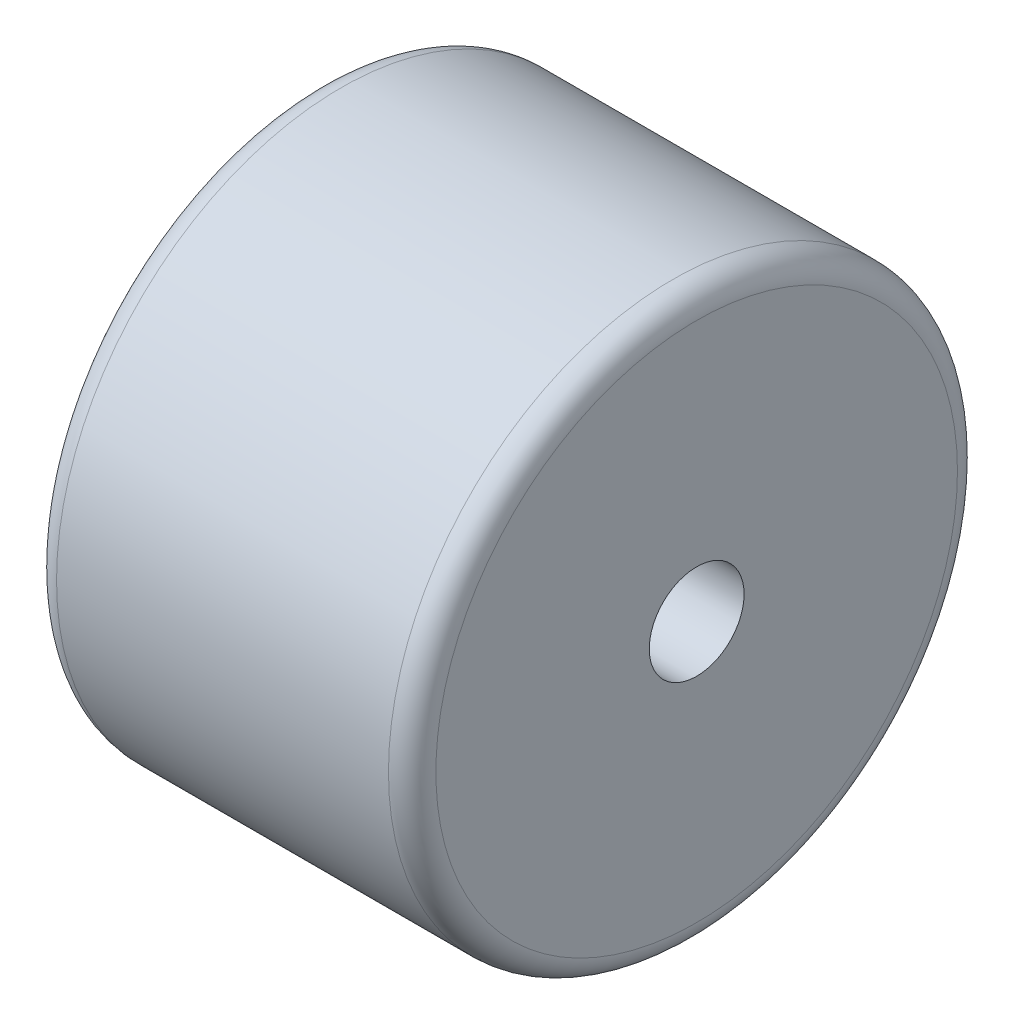
ISO-10303-21;
HEADER;
FILE_DESCRIPTION(('STEP AP214'),'2;1');
FILE_NAME('part.step','',(''),(''),'','','');
FILE_SCHEMA(('AUTOMOTIVE_DESIGN { 1 0 10303 214 1 1 1 1 }'));
ENDSEC;
DATA;
#1=APPLICATION_CONTEXT('core data for automotive mechanical design processes');
#2=APPLICATION_PROTOCOL_DEFINITION('international standard','automotive_design',2000,#1);
#3=PRODUCT_CONTEXT('',#1,'mechanical');
#4=PRODUCT('Part','Part','',(#3));
#5=PRODUCT_RELATED_PRODUCT_CATEGORY('part','',(#4));
#6=PRODUCT_DEFINITION_FORMATION('','',#4);
#7=PRODUCT_DEFINITION_CONTEXT('part definition',#1,'design');
#8=PRODUCT_DEFINITION('design','',#6,#7);
#9=PRODUCT_DEFINITION_SHAPE('','',#8);
#10=(LENGTH_UNIT() NAMED_UNIT(*) SI_UNIT(.MILLI.,.METRE.));
#11=(NAMED_UNIT(*) PLANE_ANGLE_UNIT() SI_UNIT($,.RADIAN.));
#12=(NAMED_UNIT(*) SI_UNIT($,.STERADIAN.) SOLID_ANGLE_UNIT());
#13=UNCERTAINTY_MEASURE_WITH_UNIT(LENGTH_MEASURE(1.E-05),#10,'distance_accuracy_value','');
#14=(GEOMETRIC_REPRESENTATION_CONTEXT(3) GLOBAL_UNCERTAINTY_ASSIGNED_CONTEXT((#13)) GLOBAL_UNIT_ASSIGNED_CONTEXT((#10,
#11,#12)) REPRESENTATION_CONTEXT('',''));
#15=CARTESIAN_POINT('',(0.,0.,0.));
#16=DIRECTION('',(0.,0.,1.));
#17=DIRECTION('',(1.,0.,0.));
#18=AXIS2_PLACEMENT_3D('',#15,#16,#17);
#19=CARTESIAN_POINT('',(6.35,0.,0.));
#20=DIRECTION('',(1.,0.,0.));
#21=DIRECTION('',(0.,0.,-1.));
#22=AXIS2_PLACEMENT_3D('',#19,#20,#21);
#23=PLANE('',#22);
#24=CARTESIAN_POINT('',(6.35,0.,0.));
#25=DIRECTION('',(1.,0.,0.));
#26=DIRECTION('',(0.,0.,-1.));
#27=AXIS2_PLACEMENT_3D('',#24,#25,#26);
#28=CIRCLE('',#27,8.73125);
#29=CARTESIAN_POINT('',(6.35,0.,-8.73125));
#30=VERTEX_POINT('',#29);
#31=EDGE_CURVE('E10',#30,#30,#28,.T.);
#32=ORIENTED_EDGE('',*,*,#31,.T.);
#33=EDGE_LOOP('',(#32));
#34=FACE_BOUND('',#33,.T.);
#35=CARTESIAN_POINT('',(6.35,0.,0.));
#36=DIRECTION('',(1.,0.,0.));
#37=DIRECTION('',(0.,0.,-1.));
#38=AXIS2_PLACEMENT_3D('',#35,#36,#37);
#39=CIRCLE('',#38,1.5875);
#40=CARTESIAN_POINT('',(6.35,0.,-1.5875));
#41=VERTEX_POINT('',#40);
#42=EDGE_CURVE('E69',#41,#41,#39,.T.);
#43=ORIENTED_EDGE('',*,*,#42,.F.);
#44=EDGE_LOOP('',(#43));
#45=FACE_BOUND('',#44,.T.);
#46=ADVANCED_FACE('F45',(#34,#45),#23,.T.);
#47=CARTESIAN_POINT('',(-6.35,0.,0.));
#48=DIRECTION('',(1.,0.,0.));
#49=DIRECTION('',(0.,0.,-1.));
#50=AXIS2_PLACEMENT_3D('',#47,#48,#49);
#51=PLANE('',#50);
#52=CARTESIAN_POINT('',(-6.35,0.,0.));
#53=DIRECTION('',(1.,0.,0.));
#54=DIRECTION('',(0.,0.,-1.));
#55=AXIS2_PLACEMENT_3D('',#52,#53,#54);
#56=CIRCLE('',#55,8.73125);
#57=CARTESIAN_POINT('',(-6.35,0.,-8.73125));
#58=VERTEX_POINT('',#57);
#59=EDGE_CURVE('E53',#58,#58,#56,.F.);
#60=ORIENTED_EDGE('',*,*,#59,.T.);
#61=EDGE_LOOP('',(#60));
#62=FACE_BOUND('',#61,.T.);
#63=CARTESIAN_POINT('',(-6.35,0.,0.));
#64=DIRECTION('',(1.,0.,0.));
#65=DIRECTION('',(0.,0.,-1.));
#66=AXIS2_PLACEMENT_3D('',#63,#64,#65);
#67=CIRCLE('',#66,1.5875);
#68=CARTESIAN_POINT('',(-6.35,0.,-1.5875));
#69=VERTEX_POINT('',#68);
#70=EDGE_CURVE('E70',#69,#69,#67,.T.);
#71=ORIENTED_EDGE('',*,*,#70,.T.);
#72=EDGE_LOOP('',(#71));
#73=FACE_BOUND('',#72,.T.);
#74=ADVANCED_FACE('F82',(#62,#73),#51,.F.);
#75=CARTESIAN_POINT('',(6.35,0.,0.));
#76=DIRECTION('',(-1.,0.,0.));
#77=DIRECTION('',(0.,0.,1.));
#78=AXIS2_PLACEMENT_3D('',#75,#76,#77);
#79=CYLINDRICAL_SURFACE('',#78,9.525);
#80=CARTESIAN_POINT('',(-5.55625,0.,0.));
#81=DIRECTION('',(1.,0.,0.));
#82=DIRECTION('',(0.,0.,-1.));
#83=AXIS2_PLACEMENT_3D('',#80,#81,#82);
#84=CIRCLE('',#83,9.525);
#85=CARTESIAN_POINT('',(-5.55625,0.,-9.525));
#86=VERTEX_POINT('',#85);
#87=EDGE_CURVE('E58',#86,#86,#84,.T.);
#88=ORIENTED_EDGE('',*,*,#87,.T.);
#89=EDGE_LOOP('',(#88));
#90=FACE_BOUND('',#89,.T.);
#91=CARTESIAN_POINT('',(5.55625,0.,0.));
#92=DIRECTION('',(1.,0.,0.));
#93=DIRECTION('',(0.,0.,-1.));
#94=AXIS2_PLACEMENT_3D('',#91,#92,#93);
#95=CIRCLE('',#94,9.525);
#96=CARTESIAN_POINT('',(5.55625,0.,-9.525));
#97=VERTEX_POINT('',#96);
#98=EDGE_CURVE('E63',#97,#97,#95,.F.);
#99=ORIENTED_EDGE('',*,*,#98,.T.);
#100=EDGE_LOOP('',(#99));
#101=FACE_BOUND('',#100,.T.);
#102=ADVANCED_FACE('F88',(#90,#101),#79,.T.);
#103=CARTESIAN_POINT('',(6.35,0.,0.));
#104=DIRECTION('',(-1.,0.,0.));
#105=DIRECTION('',(0.,0.,1.));
#106=AXIS2_PLACEMENT_3D('',#103,#104,#105);
#107=CYLINDRICAL_SURFACE('',#106,1.5875);
#108=ORIENTED_EDGE('',*,*,#42,.T.);
#109=EDGE_LOOP('',(#108));
#110=FACE_BOUND('',#109,.T.);
#111=ORIENTED_EDGE('',*,*,#70,.F.);
#112=EDGE_LOOP('',(#111));
#113=FACE_BOUND('',#112,.T.);
#114=ADVANCED_FACE('F78',(#110,#113),#107,.F.);
#115=CARTESIAN_POINT('',(-5.55625,0.,0.));
#116=DIRECTION('',(1.,0.,0.));
#117=DIRECTION('',(0.,0.,-1.));
#118=AXIS2_PLACEMENT_3D('',#115,#116,#117);
#119=TOROIDAL_SURFACE('',#118,8.73125,0.79375);
#120=ORIENTED_EDGE('',*,*,#59,.F.);
#121=EDGE_LOOP('',(#120));
#122=FACE_BOUND('',#121,.T.);
#123=ORIENTED_EDGE('',*,*,#87,.F.);
#124=EDGE_LOOP('',(#123));
#125=FACE_BOUND('',#124,.T.);
#126=ADVANCED_FACE('F94',(#122,#125),#119,.T.);
#127=CARTESIAN_POINT('',(5.55625,0.,0.));
#128=DIRECTION('',(1.,0.,0.));
#129=DIRECTION('',(0.,0.,-1.));
#130=AXIS2_PLACEMENT_3D('',#127,#128,#129);
#131=TOROIDAL_SURFACE('',#130,8.73125,0.79375);
#132=ORIENTED_EDGE('',*,*,#98,.F.);
#133=EDGE_LOOP('',(#132));
#134=FACE_BOUND('',#133,.T.);
#135=ORIENTED_EDGE('',*,*,#31,.F.);
#136=EDGE_LOOP('',(#135));
#137=FACE_BOUND('',#136,.T.);
#138=ADVANCED_FACE('F47',(#134,#137),#131,.T.);
#139=CLOSED_SHELL('',(#46,#74,#102,#114,#126,#138));
#140=MANIFOLD_SOLID_BREP('B2',#139);
#141=ADVANCED_BREP_SHAPE_REPRESENTATION('',(#18,#140),#14);
#142=SHAPE_DEFINITION_REPRESENTATION(#9,#141);
ENDSEC;
END-ISO-10303-21;
